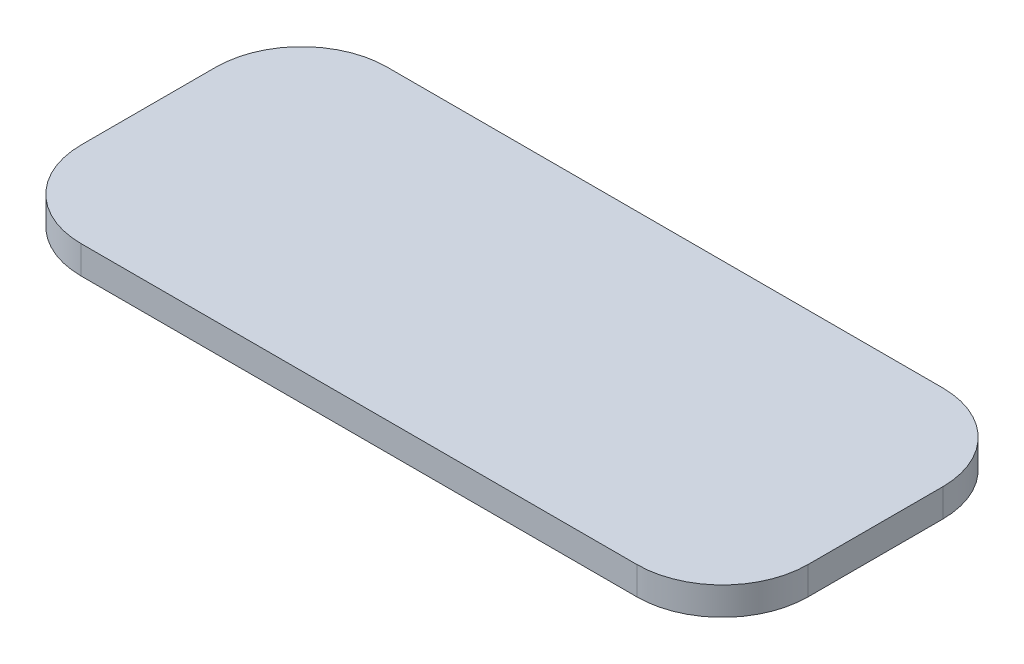
ISO-10303-21;
HEADER;
FILE_DESCRIPTION(('STEP AP214'),'2;1');
FILE_NAME('part.step','',(''),(''),'','','');
FILE_SCHEMA(('AUTOMOTIVE_DESIGN { 1 0 10303 214 1 1 1 1 }'));
ENDSEC;
DATA;
#1=APPLICATION_CONTEXT('core data for automotive mechanical design processes');
#2=APPLICATION_PROTOCOL_DEFINITION('international standard','automotive_design',2000,#1);
#3=PRODUCT_CONTEXT('',#1,'mechanical');
#4=PRODUCT('Part','Part','',(#3));
#5=PRODUCT_RELATED_PRODUCT_CATEGORY('part','',(#4));
#6=PRODUCT_DEFINITION_FORMATION('','',#4);
#7=PRODUCT_DEFINITION_CONTEXT('part definition',#1,'design');
#8=PRODUCT_DEFINITION('design','',#6,#7);
#9=PRODUCT_DEFINITION_SHAPE('','',#8);
#10=(LENGTH_UNIT() NAMED_UNIT(*) SI_UNIT(.MILLI.,.METRE.));
#11=(NAMED_UNIT(*) PLANE_ANGLE_UNIT() SI_UNIT($,.RADIAN.));
#12=(NAMED_UNIT(*) SI_UNIT($,.STERADIAN.) SOLID_ANGLE_UNIT());
#13=UNCERTAINTY_MEASURE_WITH_UNIT(LENGTH_MEASURE(1.E-05),#10,'distance_accuracy_value','');
#14=(GEOMETRIC_REPRESENTATION_CONTEXT(3) GLOBAL_UNCERTAINTY_ASSIGNED_CONTEXT((#13)) GLOBAL_UNIT_ASSIGNED_CONTEXT((#10,
#11,#12)) REPRESENTATION_CONTEXT('',''));
#15=CARTESIAN_POINT('',(0.,0.,0.));
#16=DIRECTION('',(0.,0.,1.));
#17=DIRECTION('',(1.,0.,0.));
#18=AXIS2_PLACEMENT_3D('',#15,#16,#17);
#19=CARTESIAN_POINT('',(25.9,2.,-10.9));
#20=DIRECTION('',(-1.,0.,0.));
#21=DIRECTION('',(0.,0.,1.));
#22=AXIS2_PLACEMENT_3D('',#19,#20,#21);
#23=PLANE('',#22);
#24=DIRECTION('',(0.,0.,-1.));
#25=VECTOR('',#24,1.);
#26=CARTESIAN_POINT('',(25.9,0.,-10.9));
#27=LINE('',#26,#25);
#28=CARTESIAN_POINT('',(25.9,0.,4.8));
#29=VERTEX_POINT('',#28);
#30=CARTESIAN_POINT('',(25.9,0.,-4.8));
#31=VERTEX_POINT('',#30);
#32=EDGE_CURVE('E160',#29,#31,#27,.T.);
#33=ORIENTED_EDGE('',*,*,#32,.T.);
#34=DIRECTION('',(0.,-1.,0.));
#35=VECTOR('',#34,1.);
#36=CARTESIAN_POINT('',(25.9,2.,-4.8));
#37=LINE('',#36,#35);
#38=CARTESIAN_POINT('',(25.9,2.,-4.8));
#39=VERTEX_POINT('',#38);
#40=EDGE_CURVE('E11',#31,#39,#37,.F.);
#41=ORIENTED_EDGE('',*,*,#40,.T.);
#42=DIRECTION('',(0.,0.,-1.));
#43=VECTOR('',#42,1.);
#44=CARTESIAN_POINT('',(25.9,2.,-10.9));
#45=LINE('',#44,#43);
#46=CARTESIAN_POINT('',(25.9,2.,4.8));
#47=VERTEX_POINT('',#46);
#48=EDGE_CURVE('E128',#47,#39,#45,.T.);
#49=ORIENTED_EDGE('',*,*,#48,.F.);
#50=DIRECTION('',(0.,-1.,0.));
#51=VECTOR('',#50,1.);
#52=CARTESIAN_POINT('',(25.9,2.,4.8));
#53=LINE('',#52,#51);
#54=EDGE_CURVE('E44',#47,#29,#53,.T.);
#55=ORIENTED_EDGE('',*,*,#54,.T.);
#56=EDGE_LOOP('',(#33,#41,#49,#55));
#57=FACE_BOUND('',#56,.T.);
#58=ADVANCED_FACE('F36',(#57),#23,.F.);
#59=CARTESIAN_POINT('',(-25.9,2.,-10.9));
#60=DIRECTION('',(0.,0.,1.));
#61=DIRECTION('',(1.,0.,0.));
#62=AXIS2_PLACEMENT_3D('',#59,#60,#61);
#63=PLANE('',#62);
#64=DIRECTION('',(-1.,0.,0.));
#65=VECTOR('',#64,1.);
#66=CARTESIAN_POINT('',(-25.9,0.,-10.9));
#67=LINE('',#66,#65);
#68=CARTESIAN_POINT('',(19.8,0.,-10.9));
#69=VERTEX_POINT('',#68);
#70=CARTESIAN_POINT('',(-19.8,0.,-10.9));
#71=VERTEX_POINT('',#70);
#72=EDGE_CURVE('E133',#69,#71,#67,.T.);
#73=ORIENTED_EDGE('',*,*,#72,.T.);
#74=DIRECTION('',(0.,-1.,0.));
#75=VECTOR('',#74,1.);
#76=CARTESIAN_POINT('',(-19.8,2.,-10.9));
#77=LINE('',#76,#75);
#78=CARTESIAN_POINT('',(-19.8,2.,-10.9));
#79=VERTEX_POINT('',#78);
#80=EDGE_CURVE('E51',#71,#79,#77,.F.);
#81=ORIENTED_EDGE('',*,*,#80,.T.);
#82=DIRECTION('',(-1.,0.,0.));
#83=VECTOR('',#82,1.);
#84=CARTESIAN_POINT('',(-25.9,2.,-10.9));
#85=LINE('',#84,#83);
#86=CARTESIAN_POINT('',(19.8,2.,-10.9));
#87=VERTEX_POINT('',#86);
#88=EDGE_CURVE('E131',#87,#79,#85,.T.);
#89=ORIENTED_EDGE('',*,*,#88,.F.);
#90=DIRECTION('',(0.,-1.,0.));
#91=VECTOR('',#90,1.);
#92=CARTESIAN_POINT('',(19.8,2.,-10.9));
#93=LINE('',#92,#91);
#94=EDGE_CURVE('E152',#87,#69,#93,.T.);
#95=ORIENTED_EDGE('',*,*,#94,.T.);
#96=EDGE_LOOP('',(#73,#81,#89,#95));
#97=FACE_BOUND('',#96,.T.);
#98=ADVANCED_FACE('F180',(#97),#63,.F.);
#99=CARTESIAN_POINT('',(-25.9,2.,-10.9));
#100=DIRECTION('',(1.,0.,0.));
#101=DIRECTION('',(0.,0.,-1.));
#102=AXIS2_PLACEMENT_3D('',#99,#100,#101);
#103=PLANE('',#102);
#104=DIRECTION('',(0.,0.,1.));
#105=VECTOR('',#104,1.);
#106=CARTESIAN_POINT('',(-25.9,0.,-10.9));
#107=LINE('',#106,#105);
#108=CARTESIAN_POINT('',(-25.9,0.,-4.8));
#109=VERTEX_POINT('',#108);
#110=CARTESIAN_POINT('',(-25.9,0.,4.8));
#111=VERTEX_POINT('',#110);
#112=EDGE_CURVE('E129',#109,#111,#107,.T.);
#113=ORIENTED_EDGE('',*,*,#112,.T.);
#114=DIRECTION('',(0.,-1.,0.));
#115=VECTOR('',#114,1.);
#116=CARTESIAN_POINT('',(-25.9,2.,4.8));
#117=LINE('',#116,#115);
#118=CARTESIAN_POINT('',(-25.9,2.,4.8));
#119=VERTEX_POINT('',#118);
#120=EDGE_CURVE('E107',#111,#119,#117,.F.);
#121=ORIENTED_EDGE('',*,*,#120,.T.);
#122=DIRECTION('',(0.,0.,1.));
#123=VECTOR('',#122,1.);
#124=CARTESIAN_POINT('',(-25.9,2.,-10.9));
#125=LINE('',#124,#123);
#126=CARTESIAN_POINT('',(-25.9,2.,-4.8));
#127=VERTEX_POINT('',#126);
#128=EDGE_CURVE('E168',#127,#119,#125,.T.);
#129=ORIENTED_EDGE('',*,*,#128,.F.);
#130=DIRECTION('',(0.,-1.,0.));
#131=VECTOR('',#130,1.);
#132=CARTESIAN_POINT('',(-25.9,2.,-4.8));
#133=LINE('',#132,#131);
#134=EDGE_CURVE('E112',#127,#109,#133,.T.);
#135=ORIENTED_EDGE('',*,*,#134,.T.);
#136=EDGE_LOOP('',(#113,#121,#129,#135));
#137=FACE_BOUND('',#136,.T.);
#138=ADVANCED_FACE('F179',(#137),#103,.F.);
#139=CARTESIAN_POINT('',(-25.9,2.,10.9));
#140=DIRECTION('',(0.,0.,-1.));
#141=DIRECTION('',(-1.,0.,0.));
#142=AXIS2_PLACEMENT_3D('',#139,#140,#141);
#143=PLANE('',#142);
#144=DIRECTION('',(1.,0.,0.));
#145=VECTOR('',#144,1.);
#146=CARTESIAN_POINT('',(-25.9,2.,10.9));
#147=LINE('',#146,#145);
#148=CARTESIAN_POINT('',(-19.8,2.,10.9));
#149=VERTEX_POINT('',#148);
#150=CARTESIAN_POINT('',(19.8,2.,10.9));
#151=VERTEX_POINT('',#150);
#152=EDGE_CURVE('E122',#149,#151,#147,.T.);
#153=ORIENTED_EDGE('',*,*,#152,.F.);
#154=DIRECTION('',(0.,-1.,0.));
#155=VECTOR('',#154,1.);
#156=CARTESIAN_POINT('',(-19.8,2.,10.9));
#157=LINE('',#156,#155);
#158=CARTESIAN_POINT('',(-19.8,0.,10.9));
#159=VERTEX_POINT('',#158);
#160=EDGE_CURVE('E106',#149,#159,#157,.T.);
#161=ORIENTED_EDGE('',*,*,#160,.T.);
#162=DIRECTION('',(1.,0.,0.));
#163=VECTOR('',#162,1.);
#164=CARTESIAN_POINT('',(-25.9,0.,10.9));
#165=LINE('',#164,#163);
#166=CARTESIAN_POINT('',(19.8,0.,10.9));
#167=VERTEX_POINT('',#166);
#168=EDGE_CURVE('E119',#159,#167,#165,.T.);
#169=ORIENTED_EDGE('',*,*,#168,.T.);
#170=DIRECTION('',(0.,-1.,0.));
#171=VECTOR('',#170,1.);
#172=CARTESIAN_POINT('',(19.8,2.,10.9));
#173=LINE('',#172,#171);
#174=EDGE_CURVE('E124',#167,#151,#173,.F.);
#175=ORIENTED_EDGE('',*,*,#174,.T.);
#176=EDGE_LOOP('',(#153,#161,#169,#175));
#177=FACE_BOUND('',#176,.T.);
#178=ADVANCED_FACE('F118',(#177),#143,.F.);
#179=CARTESIAN_POINT('',(0.,2.,0.));
#180=DIRECTION('',(0.,1.,0.));
#181=DIRECTION('',(0.,0.,1.));
#182=AXIS2_PLACEMENT_3D('',#179,#180,#181);
#183=PLANE('',#182);
#184=ORIENTED_EDGE('',*,*,#128,.T.);
#185=CARTESIAN_POINT('',(-19.8,2.,4.8));
#186=DIRECTION('',(0.,1.,0.));
#187=DIRECTION('',(0.,0.,1.));
#188=AXIS2_PLACEMENT_3D('',#185,#186,#187);
#189=CIRCLE('',#188,6.1);
#190=EDGE_CURVE('E150',#119,#149,#189,.T.);
#191=ORIENTED_EDGE('',*,*,#190,.T.);
#192=ORIENTED_EDGE('',*,*,#152,.T.);
#193=CARTESIAN_POINT('',(19.8,2.,4.8));
#194=DIRECTION('',(0.,1.,0.));
#195=DIRECTION('',(0.,0.,1.));
#196=AXIS2_PLACEMENT_3D('',#193,#194,#195);
#197=CIRCLE('',#196,6.1);
#198=EDGE_CURVE('E145',#151,#47,#197,.T.);
#199=ORIENTED_EDGE('',*,*,#198,.T.);
#200=ORIENTED_EDGE('',*,*,#48,.T.);
#201=CARTESIAN_POINT('',(19.8,2.,-4.8));
#202=DIRECTION('',(0.,1.,0.));
#203=DIRECTION('',(0.,0.,1.));
#204=AXIS2_PLACEMENT_3D('',#201,#202,#203);
#205=CIRCLE('',#204,6.1);
#206=EDGE_CURVE('E58',#39,#87,#205,.T.);
#207=ORIENTED_EDGE('',*,*,#206,.T.);
#208=ORIENTED_EDGE('',*,*,#88,.T.);
#209=CARTESIAN_POINT('',(-19.8,2.,-4.8));
#210=DIRECTION('',(0.,1.,0.));
#211=DIRECTION('',(0.,0.,1.));
#212=AXIS2_PLACEMENT_3D('',#209,#210,#211);
#213=CIRCLE('',#212,6.1);
#214=EDGE_CURVE('E148',#79,#127,#213,.T.);
#215=ORIENTED_EDGE('',*,*,#214,.T.);
#216=EDGE_LOOP('',(#184,#191,#192,#199,#200,#207,#208,#215));
#217=FACE_BOUND('',#216,.T.);
#218=ADVANCED_FACE('F172',(#217),#183,.T.);
#219=CARTESIAN_POINT('',(0.,0.,0.));
#220=DIRECTION('',(0.,1.,0.));
#221=DIRECTION('',(0.,0.,1.));
#222=AXIS2_PLACEMENT_3D('',#219,#220,#221);
#223=PLANE('',#222);
#224=ORIENTED_EDGE('',*,*,#168,.F.);
#225=CARTESIAN_POINT('',(-19.8,0.,4.8));
#226=DIRECTION('',(0.,1.,0.));
#227=DIRECTION('',(0.,0.,1.));
#228=AXIS2_PLACEMENT_3D('',#225,#226,#227);
#229=CIRCLE('',#228,6.1);
#230=EDGE_CURVE('E102',#159,#111,#229,.F.);
#231=ORIENTED_EDGE('',*,*,#230,.T.);
#232=ORIENTED_EDGE('',*,*,#112,.F.);
#233=CARTESIAN_POINT('',(-19.8,0.,-4.8));
#234=DIRECTION('',(0.,1.,0.));
#235=DIRECTION('',(0.,0.,1.));
#236=AXIS2_PLACEMENT_3D('',#233,#234,#235);
#237=CIRCLE('',#236,6.1);
#238=EDGE_CURVE('E113',#109,#71,#237,.F.);
#239=ORIENTED_EDGE('',*,*,#238,.T.);
#240=ORIENTED_EDGE('',*,*,#72,.F.);
#241=CARTESIAN_POINT('',(19.8,0.,-4.8));
#242=DIRECTION('',(0.,1.,0.));
#243=DIRECTION('',(0.,0.,1.));
#244=AXIS2_PLACEMENT_3D('',#241,#242,#243);
#245=CIRCLE('',#244,6.1);
#246=EDGE_CURVE('E139',#69,#31,#245,.F.);
#247=ORIENTED_EDGE('',*,*,#246,.T.);
#248=ORIENTED_EDGE('',*,*,#32,.F.);
#249=CARTESIAN_POINT('',(19.8,0.,4.8));
#250=DIRECTION('',(0.,1.,0.));
#251=DIRECTION('',(0.,0.,1.));
#252=AXIS2_PLACEMENT_3D('',#249,#250,#251);
#253=CIRCLE('',#252,6.1);
#254=EDGE_CURVE('E123',#29,#167,#253,.F.);
#255=ORIENTED_EDGE('',*,*,#254,.T.);
#256=EDGE_LOOP('',(#224,#231,#232,#239,#240,#247,#248,#255));
#257=FACE_BOUND('',#256,.T.);
#258=ADVANCED_FACE('F126',(#257),#223,.F.);
#259=CARTESIAN_POINT('',(-19.8,2.,4.8));
#260=DIRECTION('',(0.,-1.,0.));
#261=DIRECTION('',(0.,0.,-1.));
#262=AXIS2_PLACEMENT_3D('',#259,#260,#261);
#263=CYLINDRICAL_SURFACE('',#262,6.1);
#264=ORIENTED_EDGE('',*,*,#190,.F.);
#265=ORIENTED_EDGE('',*,*,#120,.F.);
#266=ORIENTED_EDGE('',*,*,#230,.F.);
#267=ORIENTED_EDGE('',*,*,#160,.F.);
#268=EDGE_LOOP('',(#264,#265,#266,#267));
#269=FACE_BOUND('',#268,.T.);
#270=ADVANCED_FACE('F105',(#269),#263,.T.);
#271=CARTESIAN_POINT('',(-19.8,2.,-4.8));
#272=DIRECTION('',(0.,-1.,0.));
#273=DIRECTION('',(0.,0.,-1.));
#274=AXIS2_PLACEMENT_3D('',#271,#272,#273);
#275=CYLINDRICAL_SURFACE('',#274,6.1);
#276=ORIENTED_EDGE('',*,*,#214,.F.);
#277=ORIENTED_EDGE('',*,*,#80,.F.);
#278=ORIENTED_EDGE('',*,*,#238,.F.);
#279=ORIENTED_EDGE('',*,*,#134,.F.);
#280=EDGE_LOOP('',(#276,#277,#278,#279));
#281=FACE_BOUND('',#280,.T.);
#282=ADVANCED_FACE('F177',(#281),#275,.T.);
#283=CARTESIAN_POINT('',(19.8,2.,-4.8));
#284=DIRECTION('',(0.,-1.,0.));
#285=DIRECTION('',(0.,0.,-1.));
#286=AXIS2_PLACEMENT_3D('',#283,#284,#285);
#287=CYLINDRICAL_SURFACE('',#286,6.1);
#288=ORIENTED_EDGE('',*,*,#206,.F.);
#289=ORIENTED_EDGE('',*,*,#40,.F.);
#290=ORIENTED_EDGE('',*,*,#246,.F.);
#291=ORIENTED_EDGE('',*,*,#94,.F.);
#292=EDGE_LOOP('',(#288,#289,#290,#291));
#293=FACE_BOUND('',#292,.T.);
#294=ADVANCED_FACE('F182',(#293),#287,.T.);
#295=CARTESIAN_POINT('',(19.8,2.,4.8));
#296=DIRECTION('',(0.,-1.,0.));
#297=DIRECTION('',(0.,0.,-1.));
#298=AXIS2_PLACEMENT_3D('',#295,#296,#297);
#299=CYLINDRICAL_SURFACE('',#298,6.1);
#300=ORIENTED_EDGE('',*,*,#198,.F.);
#301=ORIENTED_EDGE('',*,*,#174,.F.);
#302=ORIENTED_EDGE('',*,*,#254,.F.);
#303=ORIENTED_EDGE('',*,*,#54,.F.);
#304=EDGE_LOOP('',(#300,#301,#302,#303));
#305=FACE_BOUND('',#304,.T.);
#306=ADVANCED_FACE('F38',(#305),#299,.T.);
#307=CLOSED_SHELL('',(#58,#98,#138,#178,#218,#258,#270,#282,#294,#306));
#308=MANIFOLD_SOLID_BREP('B2',#307);
#309=ADVANCED_BREP_SHAPE_REPRESENTATION('',(#18,#308),#14);
#310=SHAPE_DEFINITION_REPRESENTATION(#9,#309);
ENDSEC;
END-ISO-10303-21;
